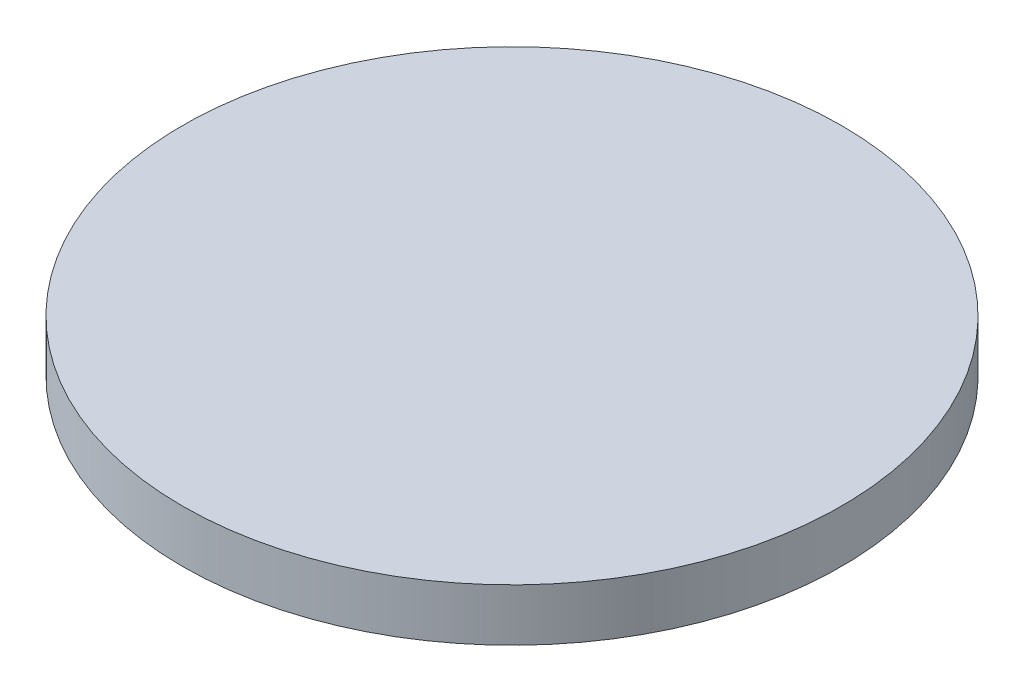
ISO-10303-21;
HEADER;
FILE_DESCRIPTION(('STEP AP214'),'2;1');
FILE_NAME('part.step','',(''),(''),'','','');
FILE_SCHEMA(('AUTOMOTIVE_DESIGN { 1 0 10303 214 1 1 1 1 }'));
ENDSEC;
DATA;
#1=APPLICATION_CONTEXT('core data for automotive mechanical design processes');
#2=APPLICATION_PROTOCOL_DEFINITION('international standard','automotive_design',2000,#1);
#3=PRODUCT_CONTEXT('',#1,'mechanical');
#4=PRODUCT('Part','Part','',(#3));
#5=PRODUCT_RELATED_PRODUCT_CATEGORY('part','',(#4));
#6=PRODUCT_DEFINITION_FORMATION('','',#4);
#7=PRODUCT_DEFINITION_CONTEXT('part definition',#1,'design');
#8=PRODUCT_DEFINITION('design','',#6,#7);
#9=PRODUCT_DEFINITION_SHAPE('','',#8);
#10=(LENGTH_UNIT() NAMED_UNIT(*) SI_UNIT(.MILLI.,.METRE.));
#11=(NAMED_UNIT(*) PLANE_ANGLE_UNIT() SI_UNIT($,.RADIAN.));
#12=(NAMED_UNIT(*) SI_UNIT($,.STERADIAN.) SOLID_ANGLE_UNIT());
#13=UNCERTAINTY_MEASURE_WITH_UNIT(LENGTH_MEASURE(1.E-05),#10,'distance_accuracy_value','');
#14=(GEOMETRIC_REPRESENTATION_CONTEXT(3) GLOBAL_UNCERTAINTY_ASSIGNED_CONTEXT((#13)) GLOBAL_UNIT_ASSIGNED_CONTEXT((#10,
#11,#12)) REPRESENTATION_CONTEXT('',''));
#15=CARTESIAN_POINT('',(0.,0.,0.));
#16=DIRECTION('',(0.,0.,1.));
#17=DIRECTION('',(1.,0.,0.));
#18=AXIS2_PLACEMENT_3D('',#15,#16,#17);
#19=CARTESIAN_POINT('',(0.,6.35,0.));
#20=DIRECTION('',(0.,-1.,0.));
#21=DIRECTION('',(0.,0.,-1.));
#22=AXIS2_PLACEMENT_3D('',#19,#20,#21);
#23=CYLINDRICAL_SURFACE('',#22,40.);
#24=CARTESIAN_POINT('',(0.,6.35,0.));
#25=DIRECTION('',(0.,1.,0.));
#26=DIRECTION('',(0.,0.,1.));
#27=AXIS2_PLACEMENT_3D('',#24,#25,#26);
#28=CIRCLE('',#27,40.);
#29=CARTESIAN_POINT('',(0.,6.35,40.));
#30=VERTEX_POINT('',#29);
#31=EDGE_CURVE('E10',#30,#30,#28,.T.);
#32=ORIENTED_EDGE('',*,*,#31,.F.);
#33=EDGE_LOOP('',(#32));
#34=FACE_BOUND('',#33,.T.);
#35=CARTESIAN_POINT('',(0.,0.,0.));
#36=DIRECTION('',(0.,1.,0.));
#37=DIRECTION('',(0.,0.,1.));
#38=AXIS2_PLACEMENT_3D('',#35,#36,#37);
#39=CIRCLE('',#38,40.);
#40=CARTESIAN_POINT('',(0.,0.,40.));
#41=VERTEX_POINT('',#40);
#42=EDGE_CURVE('E35',#41,#41,#39,.T.);
#43=ORIENTED_EDGE('',*,*,#42,.T.);
#44=EDGE_LOOP('',(#43));
#45=FACE_BOUND('',#44,.T.);
#46=ADVANCED_FACE('F32',(#34,#45),#23,.T.);
#47=CARTESIAN_POINT('',(0.,6.35,0.));
#48=DIRECTION('',(0.,1.,0.));
#49=DIRECTION('',(0.,0.,1.));
#50=AXIS2_PLACEMENT_3D('',#47,#48,#49);
#51=PLANE('',#50);
#52=ORIENTED_EDGE('',*,*,#31,.T.);
#53=EDGE_LOOP('',(#52));
#54=FACE_BOUND('',#53,.T.);
#55=ADVANCED_FACE('F47',(#54),#51,.T.);
#56=CARTESIAN_POINT('',(0.,0.,0.));
#57=DIRECTION('',(0.,1.,0.));
#58=DIRECTION('',(0.,0.,1.));
#59=AXIS2_PLACEMENT_3D('',#56,#57,#58);
#60=PLANE('',#59);
#61=ORIENTED_EDGE('',*,*,#42,.F.);
#62=EDGE_LOOP('',(#61));
#63=FACE_BOUND('',#62,.T.);
#64=ADVANCED_FACE('F45',(#63),#60,.F.);
#65=CLOSED_SHELL('',(#46,#55,#64));
#66=MANIFOLD_SOLID_BREP('B2',#65);
#67=ADVANCED_BREP_SHAPE_REPRESENTATION('',(#18,#66),#14);
#68=SHAPE_DEFINITION_REPRESENTATION(#9,#67);
ENDSEC;
END-ISO-10303-21;
